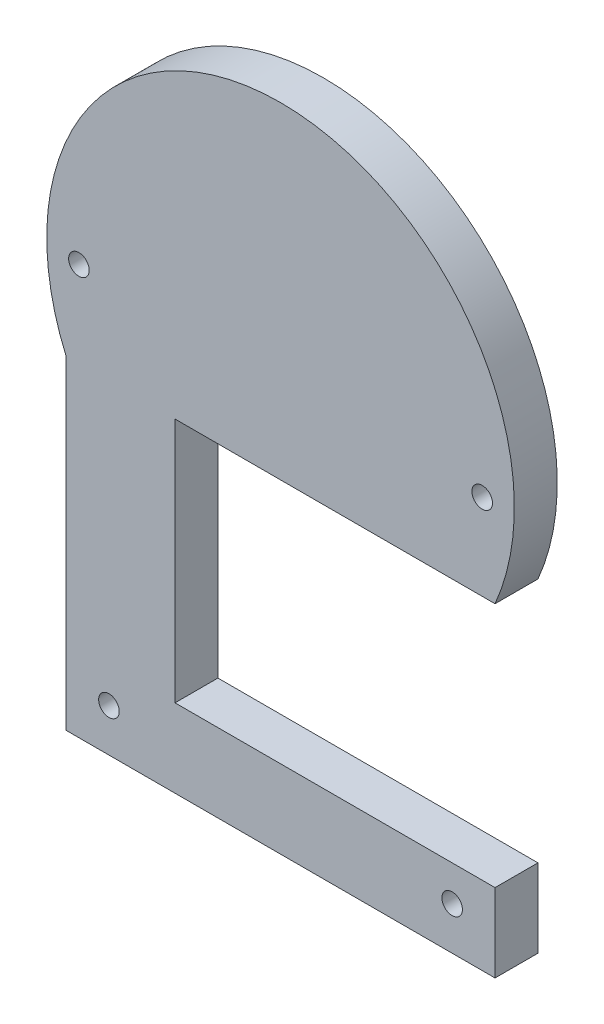
ISO-10303-21;
HEADER;
FILE_DESCRIPTION(('STEP AP214'),'2;1');
FILE_NAME('part.step','',(''),(''),'','','');
FILE_SCHEMA(('AUTOMOTIVE_DESIGN { 1 0 10303 214 1 1 1 1 }'));
ENDSEC;
DATA;
#1=APPLICATION_CONTEXT('core data for automotive mechanical design processes');
#2=APPLICATION_PROTOCOL_DEFINITION('international standard','automotive_design',2000,#1);
#3=PRODUCT_CONTEXT('',#1,'mechanical');
#4=PRODUCT('Part','Part','',(#3));
#5=PRODUCT_RELATED_PRODUCT_CATEGORY('part','',(#4));
#6=PRODUCT_DEFINITION_FORMATION('','',#4);
#7=PRODUCT_DEFINITION_CONTEXT('part definition',#1,'design');
#8=PRODUCT_DEFINITION('design','',#6,#7);
#9=PRODUCT_DEFINITION_SHAPE('','',#8);
#10=(LENGTH_UNIT() NAMED_UNIT(*) SI_UNIT(.MILLI.,.METRE.));
#11=(NAMED_UNIT(*) PLANE_ANGLE_UNIT() SI_UNIT($,.RADIAN.));
#12=(NAMED_UNIT(*) SI_UNIT($,.STERADIAN.) SOLID_ANGLE_UNIT());
#13=UNCERTAINTY_MEASURE_WITH_UNIT(LENGTH_MEASURE(1.E-05),#10,'distance_accuracy_value','');
#14=(GEOMETRIC_REPRESENTATION_CONTEXT(3) GLOBAL_UNCERTAINTY_ASSIGNED_CONTEXT((#13)) GLOBAL_UNIT_ASSIGNED_CONTEXT((#10,
#11,#12)) REPRESENTATION_CONTEXT('',''));
#15=CARTESIAN_POINT('',(0.,0.,0.));
#16=DIRECTION('',(0.,0.,1.));
#17=DIRECTION('',(1.,0.,0.));
#18=AXIS2_PLACEMENT_3D('',#15,#16,#17);
#19=CARTESIAN_POINT('',(0.,0.,10.));
#20=DIRECTION('',(0.,0.,-1.));
#21=DIRECTION('',(-1.,0.,0.));
#22=AXIS2_PLACEMENT_3D('',#19,#20,#21);
#23=CYLINDRICAL_SURFACE('',#22,54.5);
#24=CARTESIAN_POINT('',(0.,0.,0.));
#25=DIRECTION('',(0.,0.,1.));
#26=DIRECTION('',(1.,0.,0.));
#27=AXIS2_PLACEMENT_3D('',#24,#25,#26);
#28=CIRCLE('',#27,54.5);
#29=CARTESIAN_POINT('',(50.,-21.6852484422014,0.));
#30=VERTEX_POINT('',#29);
#31=CARTESIAN_POINT('',(-50.,-21.6852484422014,0.));
#32=VERTEX_POINT('',#31);
#33=EDGE_CURVE('E147',#30,#32,#28,.T.);
#34=ORIENTED_EDGE('',*,*,#33,.T.);
#35=DIRECTION('',(0.,0.,-1.));
#36=VECTOR('',#35,1.);
#37=CARTESIAN_POINT('',(-50.,-21.6852484422014,10.));
#38=LINE('',#37,#36);
#39=CARTESIAN_POINT('',(-50.,-21.6852484422014,10.));
#40=VERTEX_POINT('',#39);
#41=EDGE_CURVE('E130',#40,#32,#38,.T.);
#42=ORIENTED_EDGE('',*,*,#41,.F.);
#43=CARTESIAN_POINT('',(0.,0.,10.));
#44=DIRECTION('',(0.,0.,1.));
#45=DIRECTION('',(1.,0.,0.));
#46=AXIS2_PLACEMENT_3D('',#43,#44,#45);
#47=CIRCLE('',#46,54.5);
#48=CARTESIAN_POINT('',(50.,-21.6852484422014,10.));
#49=VERTEX_POINT('',#48);
#50=EDGE_CURVE('E124',#49,#40,#47,.T.);
#51=ORIENTED_EDGE('',*,*,#50,.F.);
#52=DIRECTION('',(0.,0.,-1.));
#53=VECTOR('',#52,1.);
#54=CARTESIAN_POINT('',(50.,-21.6852484422014,10.));
#55=LINE('',#54,#53);
#56=EDGE_CURVE('E106',#49,#30,#55,.T.);
#57=ORIENTED_EDGE('',*,*,#56,.T.);
#58=EDGE_LOOP('',(#34,#42,#51,#57));
#59=FACE_BOUND('',#58,.T.);
#60=ADVANCED_FACE('F38',(#59),#23,.T.);
#61=CARTESIAN_POINT('',(-50.,-97.2351882760026,10.));
#62=DIRECTION('',(1.,0.,0.));
#63=DIRECTION('',(0.,0.,-1.));
#64=AXIS2_PLACEMENT_3D('',#61,#62,#63);
#65=PLANE('',#64);
#66=DIRECTION('',(0.,-1.,0.));
#67=VECTOR('',#66,1.);
#68=CARTESIAN_POINT('',(-50.,-97.2351882760026,0.));
#69=LINE('',#68,#67);
#70=CARTESIAN_POINT('',(-50.,-97.2351882760026,0.));
#71=VERTEX_POINT('',#70);
#72=EDGE_CURVE('E150',#32,#71,#69,.T.);
#73=ORIENTED_EDGE('',*,*,#72,.T.);
#74=DIRECTION('',(0.,0.,-1.));
#75=VECTOR('',#74,1.);
#76=CARTESIAN_POINT('',(-50.,-97.2351882760026,10.));
#77=LINE('',#76,#75);
#78=CARTESIAN_POINT('',(-50.,-97.2351882760026,10.));
#79=VERTEX_POINT('',#78);
#80=EDGE_CURVE('E157',#79,#71,#77,.T.);
#81=ORIENTED_EDGE('',*,*,#80,.F.);
#82=DIRECTION('',(0.,-1.,0.));
#83=VECTOR('',#82,1.);
#84=CARTESIAN_POINT('',(-50.,-97.2351882760026,10.));
#85=LINE('',#84,#83);
#86=EDGE_CURVE('E85',#40,#79,#85,.T.);
#87=ORIENTED_EDGE('',*,*,#86,.F.);
#88=ORIENTED_EDGE('',*,*,#41,.T.);
#89=EDGE_LOOP('',(#73,#81,#87,#88));
#90=FACE_BOUND('',#89,.T.);
#91=ADVANCED_FACE('F248',(#90),#65,.F.);
#92=CARTESIAN_POINT('',(50.,-97.2351882760026,10.));
#93=DIRECTION('',(0.,1.,0.));
#94=DIRECTION('',(0.,0.,1.));
#95=AXIS2_PLACEMENT_3D('',#92,#93,#94);
#96=PLANE('',#95);
#97=DIRECTION('',(1.,0.,0.));
#98=VECTOR('',#97,1.);
#99=CARTESIAN_POINT('',(50.,-97.2351882760026,0.));
#100=LINE('',#99,#98);
#101=CARTESIAN_POINT('',(50.,-97.2351882760026,0.));
#102=VERTEX_POINT('',#101);
#103=EDGE_CURVE('E79',#71,#102,#100,.T.);
#104=ORIENTED_EDGE('',*,*,#103,.T.);
#105=DIRECTION('',(0.,0.,-1.));
#106=VECTOR('',#105,1.);
#107=CARTESIAN_POINT('',(50.,-97.2351882760026,10.));
#108=LINE('',#107,#106);
#109=CARTESIAN_POINT('',(50.,-97.2351882760026,10.));
#110=VERTEX_POINT('',#109);
#111=EDGE_CURVE('E118',#110,#102,#108,.T.);
#112=ORIENTED_EDGE('',*,*,#111,.F.);
#113=DIRECTION('',(1.,0.,0.));
#114=VECTOR('',#113,1.);
#115=CARTESIAN_POINT('',(50.,-97.2351882760026,10.));
#116=LINE('',#115,#114);
#117=EDGE_CURVE('E62',#79,#110,#116,.T.);
#118=ORIENTED_EDGE('',*,*,#117,.F.);
#119=ORIENTED_EDGE('',*,*,#80,.T.);
#120=EDGE_LOOP('',(#104,#112,#118,#119));
#121=FACE_BOUND('',#120,.T.);
#122=ADVANCED_FACE('F243',(#121),#96,.F.);
#123=CARTESIAN_POINT('',(50.,-21.6852484422014,10.));
#124=DIRECTION('',(-1.,0.,0.));
#125=DIRECTION('',(0.,0.,1.));
#126=AXIS2_PLACEMENT_3D('',#123,#124,#125);
#127=PLANE('',#126);
#128=DIRECTION('',(0.,1.,0.));
#129=VECTOR('',#128,1.);
#130=CARTESIAN_POINT('',(50.,-21.6852484422014,0.));
#131=LINE('',#130,#129);
#132=CARTESIAN_POINT('',(50.,-78.9852484422014,0.));
#133=VERTEX_POINT('',#132);
#134=EDGE_CURVE('E132',#102,#133,#131,.T.);
#135=ORIENTED_EDGE('',*,*,#134,.T.);
#136=DIRECTION('',(0.,0.,1.));
#137=VECTOR('',#136,1.);
#138=CARTESIAN_POINT('',(50.,-78.9852484422014,-5.));
#139=LINE('',#138,#137);
#140=CARTESIAN_POINT('',(50.,-78.9852484422014,10.));
#141=VERTEX_POINT('',#140);
#142=EDGE_CURVE('E174',#133,#141,#139,.T.);
#143=ORIENTED_EDGE('',*,*,#142,.T.);
#144=DIRECTION('',(0.,1.,0.));
#145=VECTOR('',#144,1.);
#146=CARTESIAN_POINT('',(50.,-21.6852484422014,10.));
#147=LINE('',#146,#145);
#148=EDGE_CURVE('E119',#110,#141,#147,.T.);
#149=ORIENTED_EDGE('',*,*,#148,.F.);
#150=ORIENTED_EDGE('',*,*,#111,.T.);
#151=EDGE_LOOP('',(#135,#143,#149,#150));
#152=FACE_BOUND('',#151,.T.);
#153=ADVANCED_FACE('F235',(#152),#127,.F.);
#154=CARTESIAN_POINT('',(0.,0.,10.));
#155=DIRECTION('',(0.,0.,1.));
#156=DIRECTION('',(1.,0.,0.));
#157=AXIS2_PLACEMENT_3D('',#154,#155,#156);
#158=PLANE('',#157);
#159=DIRECTION('',(1.,0.,0.));
#160=VECTOR('',#159,1.);
#161=CARTESIAN_POINT('',(50.,-78.9852484422014,10.));
#162=LINE('',#161,#160);
#163=CARTESIAN_POINT('',(-24.6,-78.9852484422014,10.));
#164=VERTEX_POINT('',#163);
#165=EDGE_CURVE('E181',#164,#141,#162,.T.);
#166=ORIENTED_EDGE('',*,*,#165,.F.);
#167=DIRECTION('',(0.,-1.,0.));
#168=VECTOR('',#167,1.);
#169=CARTESIAN_POINT('',(-24.6,-21.6852484422014,10.));
#170=LINE('',#169,#168);
#171=CARTESIAN_POINT('',(-24.6,-21.6852484422014,10.));
#172=VERTEX_POINT('',#171);
#173=EDGE_CURVE('E127',#172,#164,#170,.T.);
#174=ORIENTED_EDGE('',*,*,#173,.F.);
#175=DIRECTION('',(-1.,0.,0.));
#176=VECTOR('',#175,1.);
#177=CARTESIAN_POINT('',(50.,-21.6852484422014,10.));
#178=LINE('',#177,#176);
#179=EDGE_CURVE('E109',#49,#172,#178,.T.);
#180=ORIENTED_EDGE('',*,*,#179,.F.);
#181=ORIENTED_EDGE('',*,*,#50,.T.);
#182=ORIENTED_EDGE('',*,*,#86,.T.);
#183=ORIENTED_EDGE('',*,*,#117,.T.);
#184=ORIENTED_EDGE('',*,*,#148,.T.);
#185=EDGE_LOOP('',(#166,#174,#180,#181,#182,#183,#184));
#186=FACE_BOUND('',#185,.T.);
#187=CARTESIAN_POINT('',(47.,-1.68524844220143,10.));
#188=DIRECTION('',(0.,0.,1.));
#189=DIRECTION('',(1.,0.,0.));
#190=AXIS2_PLACEMENT_3D('',#187,#188,#189);
#191=CIRCLE('',#190,2.4);
#192=CARTESIAN_POINT('',(49.4,-1.68524844220143,10.));
#193=VERTEX_POINT('',#192);
#194=EDGE_CURVE('E192',#193,#193,#191,.T.);
#195=ORIENTED_EDGE('',*,*,#194,.F.);
#196=EDGE_LOOP('',(#195));
#197=FACE_BOUND('',#196,.T.);
#198=CARTESIAN_POINT('',(-47.,-1.68524844220143,10.));
#199=DIRECTION('',(0.,0.,1.));
#200=DIRECTION('',(1.,0.,0.));
#201=AXIS2_PLACEMENT_3D('',#198,#199,#200);
#202=CIRCLE('',#201,2.4);
#203=CARTESIAN_POINT('',(-44.6,-1.68524844220143,10.));
#204=VERTEX_POINT('',#203);
#205=EDGE_CURVE('E204',#204,#204,#202,.T.);
#206=ORIENTED_EDGE('',*,*,#205,.F.);
#207=EDGE_LOOP('',(#206));
#208=FACE_BOUND('',#207,.T.);
#209=CARTESIAN_POINT('',(-40.,-87.2351882760026,10.));
#210=DIRECTION('',(0.,0.,1.));
#211=DIRECTION('',(1.,0.,0.));
#212=AXIS2_PLACEMENT_3D('',#209,#210,#211);
#213=CIRCLE('',#212,2.4);
#214=CARTESIAN_POINT('',(-37.6,-87.2351882760026,10.));
#215=VERTEX_POINT('',#214);
#216=EDGE_CURVE('E216',#215,#215,#213,.T.);
#217=ORIENTED_EDGE('',*,*,#216,.F.);
#218=EDGE_LOOP('',(#217));
#219=FACE_BOUND('',#218,.T.);
#220=CARTESIAN_POINT('',(40.,-87.2351882760026,10.));
#221=DIRECTION('',(0.,0.,1.));
#222=DIRECTION('',(1.,0.,0.));
#223=AXIS2_PLACEMENT_3D('',#220,#221,#222);
#224=CIRCLE('',#223,2.4);
#225=CARTESIAN_POINT('',(42.4,-87.2351882760026,10.));
#226=VERTEX_POINT('',#225);
#227=EDGE_CURVE('E140',#226,#226,#224,.T.);
#228=ORIENTED_EDGE('',*,*,#227,.F.);
#229=EDGE_LOOP('',(#228));
#230=FACE_BOUND('',#229,.T.);
#231=ADVANCED_FACE('F122',(#186,#197,#208,#219,#230),#158,.T.);
#232=CARTESIAN_POINT('',(0.,0.,0.));
#233=DIRECTION('',(0.,0.,1.));
#234=DIRECTION('',(1.,0.,0.));
#235=AXIS2_PLACEMENT_3D('',#232,#233,#234);
#236=PLANE('',#235);
#237=CARTESIAN_POINT('',(47.,-1.68524844220143,0.));
#238=DIRECTION('',(0.,0.,-1.));
#239=DIRECTION('',(-1.,0.,0.));
#240=AXIS2_PLACEMENT_3D('',#237,#238,#239);
#241=CIRCLE('',#240,4.7);
#242=CARTESIAN_POINT('',(42.3,-1.68524844220143,0.));
#243=VERTEX_POINT('',#242);
#244=EDGE_CURVE('E179',#243,#243,#241,.T.);
#245=ORIENTED_EDGE('',*,*,#244,.F.);
#246=EDGE_LOOP('',(#245));
#247=FACE_BOUND('',#246,.T.);
#248=CARTESIAN_POINT('',(-47.,-1.68524844220143,0.));
#249=DIRECTION('',(0.,0.,-1.));
#250=DIRECTION('',(-1.,0.,0.));
#251=AXIS2_PLACEMENT_3D('',#248,#249,#250);
#252=CIRCLE('',#251,4.7);
#253=CARTESIAN_POINT('',(-51.7,-1.68524844220143,0.));
#254=VERTEX_POINT('',#253);
#255=EDGE_CURVE('E196',#254,#254,#252,.T.);
#256=ORIENTED_EDGE('',*,*,#255,.F.);
#257=EDGE_LOOP('',(#256));
#258=FACE_BOUND('',#257,.T.);
#259=CARTESIAN_POINT('',(-40.,-87.2351882760026,0.));
#260=DIRECTION('',(0.,0.,-1.));
#261=DIRECTION('',(-1.,0.,0.));
#262=AXIS2_PLACEMENT_3D('',#259,#260,#261);
#263=CIRCLE('',#262,4.7);
#264=CARTESIAN_POINT('',(-44.7,-87.2351882760026,0.));
#265=VERTEX_POINT('',#264);
#266=EDGE_CURVE('E208',#265,#265,#263,.T.);
#267=ORIENTED_EDGE('',*,*,#266,.F.);
#268=EDGE_LOOP('',(#267));
#269=FACE_BOUND('',#268,.T.);
#270=CARTESIAN_POINT('',(40.,-87.2351882760026,0.));
#271=DIRECTION('',(0.,0.,-1.));
#272=DIRECTION('',(-1.,0.,0.));
#273=AXIS2_PLACEMENT_3D('',#270,#271,#272);
#274=CIRCLE('',#273,4.7);
#275=CARTESIAN_POINT('',(35.3,-87.2351882760026,0.));
#276=VERTEX_POINT('',#275);
#277=EDGE_CURVE('E220',#276,#276,#274,.T.);
#278=ORIENTED_EDGE('',*,*,#277,.F.);
#279=EDGE_LOOP('',(#278));
#280=FACE_BOUND('',#279,.T.);
#281=DIRECTION('',(0.,-1.,0.));
#282=VECTOR('',#281,1.);
#283=CARTESIAN_POINT('',(-24.6,0.,0.));
#284=LINE('',#283,#282);
#285=CARTESIAN_POINT('',(-24.6,-21.6852484422014,0.));
#286=VERTEX_POINT('',#285);
#287=CARTESIAN_POINT('',(-24.6,-78.9852484422014,0.));
#288=VERTEX_POINT('',#287);
#289=EDGE_CURVE('E46',#286,#288,#284,.T.);
#290=ORIENTED_EDGE('',*,*,#289,.T.);
#291=DIRECTION('',(1.,0.,0.));
#292=VECTOR('',#291,1.);
#293=CARTESIAN_POINT('',(0.,-78.9852484422014,0.));
#294=LINE('',#293,#292);
#295=EDGE_CURVE('E11',#288,#133,#294,.T.);
#296=ORIENTED_EDGE('',*,*,#295,.T.);
#297=ORIENTED_EDGE('',*,*,#134,.F.);
#298=ORIENTED_EDGE('',*,*,#103,.F.);
#299=ORIENTED_EDGE('',*,*,#72,.F.);
#300=ORIENTED_EDGE('',*,*,#33,.F.);
#301=DIRECTION('',(-1.,0.,0.));
#302=VECTOR('',#301,1.);
#303=CARTESIAN_POINT('',(0.,-21.6852484422014,0.));
#304=LINE('',#303,#302);
#305=EDGE_CURVE('E112',#30,#286,#304,.T.);
#306=ORIENTED_EDGE('',*,*,#305,.T.);
#307=EDGE_LOOP('',(#290,#296,#297,#298,#299,#300,#306));
#308=FACE_BOUND('',#307,.T.);
#309=ADVANCED_FACE('F166',(#247,#258,#269,#280,#308),#236,.F.);
#310=CARTESIAN_POINT('',(40.,-87.2351882760026,0.));
#311=DIRECTION('',(0.,0.,-1.));
#312=DIRECTION('',(-1.,0.,0.));
#313=AXIS2_PLACEMENT_3D('',#310,#311,#312);
#314=CYLINDRICAL_SURFACE('',#313,2.4);
#315=CARTESIAN_POINT('',(40.,-87.2351882760026,2.3));
#316=DIRECTION('',(0.,0.,-1.));
#317=DIRECTION('',(-1.,0.,0.));
#318=AXIS2_PLACEMENT_3D('',#315,#316,#317);
#319=CIRCLE('',#318,2.4);
#320=CARTESIAN_POINT('',(37.6,-87.2351882760026,2.3));
#321=VERTEX_POINT('',#320);
#322=EDGE_CURVE('E223',#321,#321,#319,.T.);
#323=ORIENTED_EDGE('',*,*,#322,.T.);
#324=EDGE_LOOP('',(#323));
#325=FACE_BOUND('',#324,.T.);
#326=ORIENTED_EDGE('',*,*,#227,.T.);
#327=EDGE_LOOP('',(#326));
#328=FACE_BOUND('',#327,.T.);
#329=ADVANCED_FACE('F232',(#325,#328),#314,.F.);
#330=CARTESIAN_POINT('',(40.,-87.2351882760026,0.));
#331=DIRECTION('',(0.,0.,-1.));
#332=DIRECTION('',(-1.,0.,0.));
#333=AXIS2_PLACEMENT_3D('',#330,#331,#332);
#334=CONICAL_SURFACE('',#333,4.7,0.785398163397448);
#335=ORIENTED_EDGE('',*,*,#322,.F.);
#336=EDGE_LOOP('',(#335));
#337=FACE_BOUND('',#336,.T.);
#338=ORIENTED_EDGE('',*,*,#277,.T.);
#339=EDGE_LOOP('',(#338));
#340=FACE_BOUND('',#339,.T.);
#341=ADVANCED_FACE('F294',(#337,#340),#334,.F.);
#342=CARTESIAN_POINT('',(-40.,-87.2351882760026,0.));
#343=DIRECTION('',(0.,0.,-1.));
#344=DIRECTION('',(-1.,0.,0.));
#345=AXIS2_PLACEMENT_3D('',#342,#343,#344);
#346=CYLINDRICAL_SURFACE('',#345,2.4);
#347=CARTESIAN_POINT('',(-40.,-87.2351882760026,2.3));
#348=DIRECTION('',(0.,0.,-1.));
#349=DIRECTION('',(-1.,0.,0.));
#350=AXIS2_PLACEMENT_3D('',#347,#348,#349);
#351=CIRCLE('',#350,2.4);
#352=CARTESIAN_POINT('',(-42.4,-87.2351882760026,2.3));
#353=VERTEX_POINT('',#352);
#354=EDGE_CURVE('E212',#353,#353,#351,.T.);
#355=ORIENTED_EDGE('',*,*,#354,.T.);
#356=EDGE_LOOP('',(#355));
#357=FACE_BOUND('',#356,.T.);
#358=ORIENTED_EDGE('',*,*,#216,.T.);
#359=EDGE_LOOP('',(#358));
#360=FACE_BOUND('',#359,.T.);
#361=ADVANCED_FACE('F290',(#357,#360),#346,.F.);
#362=CARTESIAN_POINT('',(-40.,-87.2351882760026,0.));
#363=DIRECTION('',(0.,0.,-1.));
#364=DIRECTION('',(-1.,0.,0.));
#365=AXIS2_PLACEMENT_3D('',#362,#363,#364);
#366=CONICAL_SURFACE('',#365,4.7,0.785398163397448);
#367=ORIENTED_EDGE('',*,*,#354,.F.);
#368=EDGE_LOOP('',(#367));
#369=FACE_BOUND('',#368,.T.);
#370=ORIENTED_EDGE('',*,*,#266,.T.);
#371=EDGE_LOOP('',(#370));
#372=FACE_BOUND('',#371,.T.);
#373=ADVANCED_FACE('F286',(#369,#372),#366,.F.);
#374=CARTESIAN_POINT('',(-47.,-1.68524844220143,0.));
#375=DIRECTION('',(0.,0.,-1.));
#376=DIRECTION('',(-1.,0.,0.));
#377=AXIS2_PLACEMENT_3D('',#374,#375,#376);
#378=CYLINDRICAL_SURFACE('',#377,2.4);
#379=CARTESIAN_POINT('',(-47.,-1.68524844220143,2.3));
#380=DIRECTION('',(0.,0.,-1.));
#381=DIRECTION('',(-1.,0.,0.));
#382=AXIS2_PLACEMENT_3D('',#379,#380,#381);
#383=CIRCLE('',#382,2.4);
#384=CARTESIAN_POINT('',(-49.4,-1.68524844220143,2.3));
#385=VERTEX_POINT('',#384);
#386=EDGE_CURVE('E200',#385,#385,#383,.T.);
#387=ORIENTED_EDGE('',*,*,#386,.T.);
#388=EDGE_LOOP('',(#387));
#389=FACE_BOUND('',#388,.T.);
#390=ORIENTED_EDGE('',*,*,#205,.T.);
#391=EDGE_LOOP('',(#390));
#392=FACE_BOUND('',#391,.T.);
#393=ADVANCED_FACE('F282',(#389,#392),#378,.F.);
#394=CARTESIAN_POINT('',(-47.,-1.68524844220143,0.));
#395=DIRECTION('',(0.,0.,-1.));
#396=DIRECTION('',(-1.,0.,0.));
#397=AXIS2_PLACEMENT_3D('',#394,#395,#396);
#398=CONICAL_SURFACE('',#397,4.7,0.785398163397448);
#399=ORIENTED_EDGE('',*,*,#386,.F.);
#400=EDGE_LOOP('',(#399));
#401=FACE_BOUND('',#400,.T.);
#402=ORIENTED_EDGE('',*,*,#255,.T.);
#403=EDGE_LOOP('',(#402));
#404=FACE_BOUND('',#403,.T.);
#405=ADVANCED_FACE('F278',(#401,#404),#398,.F.);
#406=CARTESIAN_POINT('',(47.,-1.68524844220143,0.));
#407=DIRECTION('',(0.,0.,-1.));
#408=DIRECTION('',(-1.,0.,0.));
#409=AXIS2_PLACEMENT_3D('',#406,#407,#408);
#410=CYLINDRICAL_SURFACE('',#409,2.4);
#411=CARTESIAN_POINT('',(47.,-1.68524844220143,2.3));
#412=DIRECTION('',(0.,0.,-1.));
#413=DIRECTION('',(-1.,0.,0.));
#414=AXIS2_PLACEMENT_3D('',#411,#412,#413);
#415=CIRCLE('',#414,2.4);
#416=CARTESIAN_POINT('',(44.6,-1.68524844220143,2.3));
#417=VERTEX_POINT('',#416);
#418=EDGE_CURVE('E188',#417,#417,#415,.T.);
#419=ORIENTED_EDGE('',*,*,#418,.T.);
#420=EDGE_LOOP('',(#419));
#421=FACE_BOUND('',#420,.T.);
#422=ORIENTED_EDGE('',*,*,#194,.T.);
#423=EDGE_LOOP('',(#422));
#424=FACE_BOUND('',#423,.T.);
#425=ADVANCED_FACE('F270',(#421,#424),#410,.F.);
#426=CARTESIAN_POINT('',(47.,-1.68524844220143,0.));
#427=DIRECTION('',(0.,0.,-1.));
#428=DIRECTION('',(-1.,0.,0.));
#429=AXIS2_PLACEMENT_3D('',#426,#427,#428);
#430=CONICAL_SURFACE('',#429,4.7,0.785398163397448);
#431=ORIENTED_EDGE('',*,*,#418,.F.);
#432=EDGE_LOOP('',(#431));
#433=FACE_BOUND('',#432,.T.);
#434=ORIENTED_EDGE('',*,*,#244,.T.);
#435=EDGE_LOOP('',(#434));
#436=FACE_BOUND('',#435,.T.);
#437=ADVANCED_FACE('F263',(#433,#436),#430,.F.);
#438=CARTESIAN_POINT('',(50.,-78.9852484422014,-5.));
#439=DIRECTION('',(0.,-1.,0.));
#440=DIRECTION('',(1.,0.,0.));
#441=AXIS2_PLACEMENT_3D('',#438,#439,#440);
#442=PLANE('',#441);
#443=DIRECTION('',(0.,0.,1.));
#444=VECTOR('',#443,1.);
#445=CARTESIAN_POINT('',(-24.6,-78.9852484422014,-5.));
#446=LINE('',#445,#444);
#447=EDGE_CURVE('E171',#288,#164,#446,.T.);
#448=ORIENTED_EDGE('',*,*,#447,.T.);
#449=ORIENTED_EDGE('',*,*,#165,.T.);
#450=ORIENTED_EDGE('',*,*,#142,.F.);
#451=ORIENTED_EDGE('',*,*,#295,.F.);
#452=EDGE_LOOP('',(#448,#449,#450,#451));
#453=FACE_BOUND('',#452,.T.);
#454=ADVANCED_FACE('F261',(#453),#442,.F.);
#455=CARTESIAN_POINT('',(-24.6,-21.6852484422014,-5.));
#456=DIRECTION('',(-1.,0.,0.));
#457=DIRECTION('',(0.,-1.,0.));
#458=AXIS2_PLACEMENT_3D('',#455,#456,#457);
#459=PLANE('',#458);
#460=DIRECTION('',(0.,0.,1.));
#461=VECTOR('',#460,1.);
#462=CARTESIAN_POINT('',(-24.6,-21.6852484422014,-5.));
#463=LINE('',#462,#461);
#464=EDGE_CURVE('E53',#286,#172,#463,.T.);
#465=ORIENTED_EDGE('',*,*,#464,.T.);
#466=ORIENTED_EDGE('',*,*,#173,.T.);
#467=ORIENTED_EDGE('',*,*,#447,.F.);
#468=ORIENTED_EDGE('',*,*,#289,.F.);
#469=EDGE_LOOP('',(#465,#466,#467,#468));
#470=FACE_BOUND('',#469,.T.);
#471=ADVANCED_FACE('F170',(#470),#459,.F.);
#472=CARTESIAN_POINT('',(50.,-21.6852484422014,-5.));
#473=DIRECTION('',(0.,1.,0.));
#474=DIRECTION('',(-1.,0.,0.));
#475=AXIS2_PLACEMENT_3D('',#472,#473,#474);
#476=PLANE('',#475);
#477=ORIENTED_EDGE('',*,*,#56,.F.);
#478=ORIENTED_EDGE('',*,*,#179,.T.);
#479=ORIENTED_EDGE('',*,*,#464,.F.);
#480=ORIENTED_EDGE('',*,*,#305,.F.);
#481=EDGE_LOOP('',(#477,#478,#479,#480));
#482=FACE_BOUND('',#481,.T.);
#483=ADVANCED_FACE('F108',(#482),#476,.F.);
#484=CLOSED_SHELL('',(#60,#91,#122,#153,#231,#309,#329,#341,#361,#373,#393,#405,#425,#437,#454,
#471,#483));
#485=MANIFOLD_SOLID_BREP('B2',#484);
#486=ADVANCED_BREP_SHAPE_REPRESENTATION('',(#18,#485),#14);
#487=SHAPE_DEFINITION_REPRESENTATION(#9,#486);
ENDSEC;
END-ISO-10303-21;
